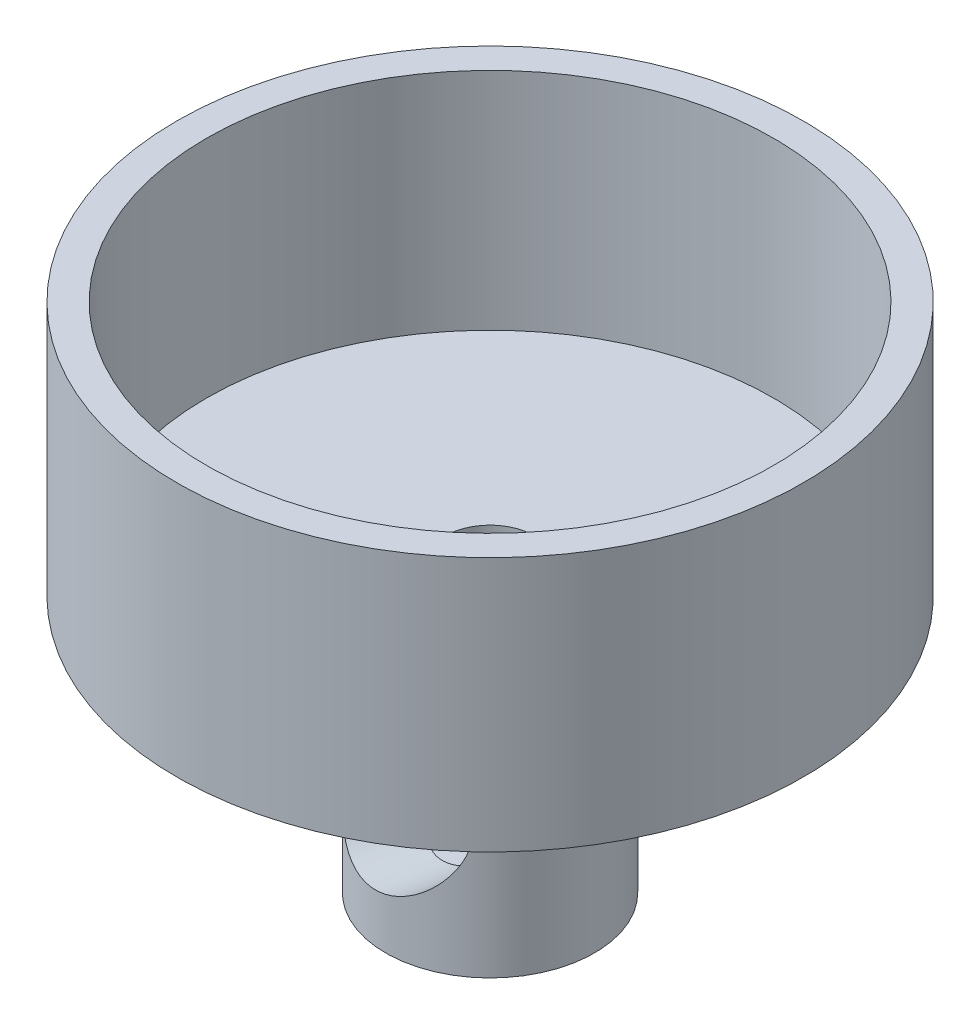
ISO-10303-21;
HEADER;
FILE_DESCRIPTION(('STEP AP214'),'2;1');
FILE_NAME('part.step','',(''),(''),'','','');
FILE_SCHEMA(('AUTOMOTIVE_DESIGN { 1 0 10303 214 1 1 1 1 }'));
ENDSEC;
DATA;
#1=APPLICATION_CONTEXT('core data for automotive mechanical design processes');
#2=APPLICATION_PROTOCOL_DEFINITION('international standard','automotive_design',2000,#1);
#3=PRODUCT_CONTEXT('',#1,'mechanical');
#4=PRODUCT('Part','Part','',(#3));
#5=PRODUCT_RELATED_PRODUCT_CATEGORY('part','',(#4));
#6=PRODUCT_DEFINITION_FORMATION('','',#4);
#7=PRODUCT_DEFINITION_CONTEXT('part definition',#1,'design');
#8=PRODUCT_DEFINITION('design','',#6,#7);
#9=PRODUCT_DEFINITION_SHAPE('','',#8);
#10=(LENGTH_UNIT() NAMED_UNIT(*) SI_UNIT(.MILLI.,.METRE.));
#11=(NAMED_UNIT(*) PLANE_ANGLE_UNIT() SI_UNIT($,.RADIAN.));
#12=(NAMED_UNIT(*) SI_UNIT($,.STERADIAN.) SOLID_ANGLE_UNIT());
#13=UNCERTAINTY_MEASURE_WITH_UNIT(LENGTH_MEASURE(1.E-05),#10,'distance_accuracy_value','');
#14=(GEOMETRIC_REPRESENTATION_CONTEXT(3) GLOBAL_UNCERTAINTY_ASSIGNED_CONTEXT((#13)) GLOBAL_UNIT_ASSIGNED_CONTEXT((#10,
#11,#12)) REPRESENTATION_CONTEXT('',''));
#15=CARTESIAN_POINT('',(0.,0.,0.));
#16=DIRECTION('',(0.,0.,1.));
#17=DIRECTION('',(1.,0.,0.));
#18=AXIS2_PLACEMENT_3D('',#15,#16,#17);
#19=CARTESIAN_POINT('',(-21.,19.835741860415,0.));
#20=DIRECTION('',(0.,1.,0.));
#21=DIRECTION('',(-1.,0.,0.));
#22=AXIS2_PLACEMENT_3D('',#19,#20,#21);
#23=PLANE('',#22);
#24=CARTESIAN_POINT('',(0.,19.835741860415,0.));
#25=DIRECTION('',(0.,1.,0.));
#26=DIRECTION('',(-1.,0.,0.));
#27=AXIS2_PLACEMENT_3D('',#24,#25,#26);
#28=CIRCLE('',#27,21.);
#29=CARTESIAN_POINT('',(-21.,19.835741860415,0.));
#30=VERTEX_POINT('',#29);
#31=EDGE_CURVE('E118',#30,#30,#28,.T.);
#32=ORIENTED_EDGE('',*,*,#31,.T.);
#33=EDGE_LOOP('',(#32));
#34=FACE_BOUND('',#33,.T.);
#35=CARTESIAN_POINT('',(0.,19.835741860415,0.));
#36=DIRECTION('',(0.,1.,0.));
#37=DIRECTION('',(-1.,0.,0.));
#38=AXIS2_PLACEMENT_3D('',#35,#36,#37);
#39=CIRCLE('',#38,19.);
#40=CARTESIAN_POINT('',(-19.,19.835741860415,0.));
#41=VERTEX_POINT('',#40);
#42=EDGE_CURVE('E46',#41,#41,#39,.T.);
#43=ORIENTED_EDGE('',*,*,#42,.F.);
#44=EDGE_LOOP('',(#43));
#45=FACE_BOUND('',#44,.T.);
#46=ADVANCED_FACE('F35',(#34,#45),#23,.T.);
#47=CARTESIAN_POINT('',(0.,8.52376627553102,0.));
#48=DIRECTION('',(0.,1.,0.));
#49=DIRECTION('',(-1.,0.,0.));
#50=AXIS2_PLACEMENT_3D('',#47,#48,#49);
#51=CYLINDRICAL_SURFACE('',#50,19.);
#52=ORIENTED_EDGE('',*,*,#42,.T.);
#53=EDGE_LOOP('',(#52));
#54=FACE_BOUND('',#53,.T.);
#55=CARTESIAN_POINT('',(0.,4.75482653047732,0.));
#56=DIRECTION('',(0.,1.,0.));
#57=DIRECTION('',(-1.,0.,0.));
#58=AXIS2_PLACEMENT_3D('',#55,#56,#57);
#59=CIRCLE('',#58,19.);
#60=CARTESIAN_POINT('',(-19.,4.75482653047732,0.));
#61=VERTEX_POINT('',#60);
#62=EDGE_CURVE('E50',#61,#61,#59,.T.);
#63=ORIENTED_EDGE('',*,*,#62,.F.);
#64=EDGE_LOOP('',(#63));
#65=FACE_BOUND('',#64,.T.);
#66=ADVANCED_FACE('F91',(#54,#65),#51,.F.);
#67=CARTESIAN_POINT('',(-19.,4.75482653047731,0.));
#68=DIRECTION('',(0.,1.,0.));
#69=DIRECTION('',(-1.,0.,0.));
#70=AXIS2_PLACEMENT_3D('',#67,#68,#69);
#71=PLANE('',#70);
#72=ORIENTED_EDGE('',*,*,#62,.T.);
#73=EDGE_LOOP('',(#72));
#74=FACE_BOUND('',#73,.T.);
#75=CARTESIAN_POINT('',(0.,4.75482653047732,0.));
#76=DIRECTION('',(0.,1.,0.));
#77=DIRECTION('',(-1.,0.,0.));
#78=AXIS2_PLACEMENT_3D('',#75,#76,#77);
#79=CIRCLE('',#78,2.99999999999999);
#80=CARTESIAN_POINT('',(-3.,4.75482653047732,0.));
#81=VERTEX_POINT('',#80);
#82=EDGE_CURVE('E103',#81,#81,#79,.T.);
#83=ORIENTED_EDGE('',*,*,#82,.F.);
#84=EDGE_LOOP('',(#83));
#85=FACE_BOUND('',#84,.T.);
#86=ADVANCED_FACE('F86',(#74,#85),#71,.T.);
#87=CARTESIAN_POINT('',(0.,8.52376627553102,0.));
#88=DIRECTION('',(0.,1.,0.));
#89=DIRECTION('',(-1.,0.,0.));
#90=AXIS2_PLACEMENT_3D('',#87,#88,#89);
#91=CYLINDRICAL_SURFACE('',#90,2.99999999999999);
#92=CARTESIAN_POINT('',(-3.,-1.61295364635005,0.));
#93=CARTESIAN_POINT('',(-2.99999813425858,-1.59300773536673,0.165449406648258));
#94=CARTESIAN_POINT('',(-2.98624962519628,-1.56436358998535,0.329844369903098));
#95=CARTESIAN_POINT('',(-2.93293143607571,-1.49444056953333,0.651631988695275));
#96=CARTESIAN_POINT('',(-2.89332336486097,-1.45314295755554,0.809013860893179));
#97=CARTESIAN_POINT('',(-2.79067278401693,-1.36369670251946,1.11249305460635));
#98=CARTESIAN_POINT('',(-2.72778837982358,-1.31559560412423,1.25865865597827));
#99=CARTESIAN_POINT('',(-2.58019495425639,-1.21730702470189,1.53871742267428));
#100=CARTESIAN_POINT('',(-2.49548460045791,-1.16711941645502,1.67260983807145));
#101=CARTESIAN_POINT('',(-2.29559308364867,-1.06401045934779,1.93929425909531));
#102=CARTESIAN_POINT('',(-2.17815018202013,-1.01135307788112,2.070503202599));
#103=CARTESIAN_POINT('',(-1.92004256627225,-0.914551055929027,2.31182679974649));
#104=CARTESIAN_POINT('',(-1.77938360900396,-0.870404310942537,2.42194666822969));
#105=CARTESIAN_POINT('',(-1.55692954750281,-0.81518104817027,2.56580524749679));
#106=CARTESIAN_POINT('',(-1.48266509020705,-0.798860849171129,2.60943957190819));
#107=CARTESIAN_POINT('',(-1.33012490240541,-0.769772138712408,2.69039179066334));
#108=CARTESIAN_POINT('',(-1.25185134828867,-0.757001723908216,2.72771306575693));
#109=CARTESIAN_POINT('',(-1.09194767520228,-0.735409473118811,2.79556550327131));
#110=CARTESIAN_POINT('',(-1.01031990120841,-0.726584928134775,2.82610131691766));
#111=CARTESIAN_POINT('',(-0.844432018577667,-0.713143470191582,2.88002655693443));
#112=CARTESIAN_POINT('',(-0.760172267472766,-0.708525988287028,2.90341694933688));
#113=CARTESIAN_POINT('',(-0.526228246838525,-0.70186380847923,2.95741558872313));
#114=CARTESIAN_POINT('',(-0.37456006920735,-0.704297251439661,2.98042298053267));
#115=CARTESIAN_POINT('',(-0.0703786990987542,-0.722308185936439,3.00305673338249));
#116=CARTESIAN_POINT('',(0.0821344347611251,-0.737884776754577,3.00268469651916));
#117=CARTESIAN_POINT('',(0.378956580699276,-0.779983920704835,2.9795738210914));
#118=CARTESIAN_POINT('',(0.523373008377095,-0.806148980666567,2.95753472227078));
#119=CARTESIAN_POINT('',(0.805708621486601,-0.867205829181671,2.89340896494964));
#120=CARTESIAN_POINT('',(0.943626510528086,-0.902099350285899,2.85131832482801));
#121=CARTESIAN_POINT('',(1.22285689700336,-0.981489992556648,2.7439049619019));
#122=CARTESIAN_POINT('',(1.36331452038127,-1.02657528314125,2.67680125468713));
#123=CARTESIAN_POINT('',(1.63144610229433,-1.12030972501868,2.52237261038033));
#124=CARTESIAN_POINT('',(1.75910671555882,-1.16896250697876,2.43502687193327));
#125=CARTESIAN_POINT('',(2.01418767971458,-1.27159326170345,2.23001295193606));
#126=CARTESIAN_POINT('',(2.13972814697185,-1.32550703314938,2.10996001589883));
#127=CARTESIAN_POINT('',(2.36937524712918,-1.42632952870933,1.84832075705914));
#128=CARTESIAN_POINT('',(2.47349997459438,-1.47324415724981,1.70675279006717));
#129=CARTESIAN_POINT('',(2.63938459828146,-1.54561380770526,1.43323580236985));
#130=CARTESIAN_POINT('',(2.70543189223863,-1.57344871417848,1.30452405891188));
#131=CARTESIAN_POINT('',(2.81874347492619,-1.6164857484919,1.0371605141926));
#132=CARTESIAN_POINT('',(2.86603112520227,-1.63170361435821,0.898521331392619));
#133=CARTESIAN_POINT('',(2.94006950262343,-1.64731326676457,0.614487487109448));
#134=CARTESIAN_POINT('',(2.96674691735029,-1.64765236459885,0.469070643313196));
#135=CARTESIAN_POINT('',(2.99841069269815,-1.63331232935741,0.176603191536284));
#136=CARTESIAN_POINT('',(3.00338754984854,-1.61862661984233,0.0295518960258319));
#137=CARTESIAN_POINT('',(2.99238928284299,-1.57747139681211,-0.254731929978259));
#138=CARTESIAN_POINT('',(2.97741099043544,-1.55160301964243,-0.392096406096173));
#139=CARTESIAN_POINT('',(2.9293376905859,-1.4912595774602,-0.661620839563119));
#140=CARTESIAN_POINT('',(2.89623610598238,-1.45678139031587,-0.79377888876065));
#141=CARTESIAN_POINT('',(2.80748615918167,-1.37740869153302,-1.06844781062637));
#142=CARTESIAN_POINT('',(2.74939394627122,-1.33173607346986,-1.20994155798187));
#143=CARTESIAN_POINT('',(2.61286710145269,-1.23788693650153,-1.48192702866313));
#144=CARTESIAN_POINT('',(2.53441569264924,-1.18970837889331,-1.61240956018069));
#145=CARTESIAN_POINT('',(2.34557424013859,-1.08802307301456,-1.87846237679876));
#146=CARTESIAN_POINT('',(2.2322014626982,-1.03475770195918,-2.01202316197116));
#147=CARTESIAN_POINT('',(1.98206600137973,-0.935861787547975,-2.25880225828007));
#148=CARTESIAN_POINT('',(1.8453069841772,-0.890230049547503,-2.37202375267036));
#149=CARTESIAN_POINT('',(1.62732413898457,-0.831951828574591,-2.52176641609383));
#150=CARTESIAN_POINT('',(1.5537557018548,-0.814418006590067,-2.56776651713635));
#151=CARTESIAN_POINT('',(1.40235278896611,-0.782829157603383,-2.65348070968102));
#152=CARTESIAN_POINT('',(1.32452060346878,-0.768772284918519,-2.69319813218819));
#153=CARTESIAN_POINT('',(1.16522795114331,-0.744574968963517,-2.76584502123201));
#154=CARTESIAN_POINT('',(1.0837701810884,-0.734431667266319,-2.79877943377275));
#155=CARTESIAN_POINT('',(0.917938494217453,-0.718363506061036,-2.85747041710355));
#156=CARTESIAN_POINT('',(0.833565004374997,-0.712438031622522,-2.88322803388806));
#157=CARTESIAN_POINT('',(0.599099927122686,-0.70226851030248,-2.94358126752397));
#158=CARTESIAN_POINT('',(0.44673821888692,-0.702541421883133,-2.97053386031378));
#159=CARTESIAN_POINT('',(0.140411595632272,-0.716587007761348,-3.00066828716248));
#160=CARTESIAN_POINT('',(-0.0135531295470067,-0.730358101110692,-3.00385290462285));
#161=CARTESIAN_POINT('',(-0.312157178842114,-0.769174057294741,-2.98730331490182));
#162=CARTESIAN_POINT('',(-0.456917048353101,-0.79372276601492,-2.96852309827844));
#163=CARTESIAN_POINT('',(-0.740417251713308,-0.851871719652209,-2.91079578933183));
#164=CARTESIAN_POINT('',(-0.879156515054024,-0.885473566690026,-2.87184512634803));
#165=CARTESIAN_POINT('',(-1.15954617838981,-0.962318212719698,-2.77118948511493));
#166=CARTESIAN_POINT('',(-1.30044277850865,-1.0061375015822,-2.70783270227802));
#167=CARTESIAN_POINT('',(-1.5699801783734,-1.09785491386373,-2.56100702856836));
#168=CARTESIAN_POINT('',(-1.6986090137445,-1.14575693456783,-2.47751877842476));
#169=CARTESIAN_POINT('',(-1.95669649456016,-1.24765773671014,-2.28053747799083));
#170=CARTESIAN_POINT('',(-2.08429980703213,-1.30167960747249,-2.164613453288));
#171=CARTESIAN_POINT('',(-2.3188412003042,-1.40381488170553,-1.91121153319989));
#172=CARTESIAN_POINT('',(-2.42579158961637,-1.45193179807711,-1.77374656460838));
#173=CARTESIAN_POINT('',(-2.59911074619047,-1.52827060559715,-1.50516844928089));
#174=CARTESIAN_POINT('',(-2.66930163937853,-1.55849646812629,-1.37709920534921));
#175=CARTESIAN_POINT('',(-2.79084706870754,-1.60658411971155,-1.11022390501737));
#176=CARTESIAN_POINT('',(-2.84222852634927,-1.62446361260189,-0.971433541040086));
#177=CARTESIAN_POINT('',(-2.92182312136273,-1.64468829092643,-0.694632768357372));
#178=CARTESIAN_POINT('',(-2.95116529890911,-1.64784169472833,-0.557007810226554));
#179=CARTESIAN_POINT('',(-2.99025895238495,-1.64037398673029,-0.279340133237803));
#180=CARTESIAN_POINT('',(-3.00000157081838,-1.62974665066022,-0.139296350078035));
#181=CARTESIAN_POINT('',(-3.,-1.61295364635005,0.));
#182=B_SPLINE_CURVE_WITH_KNOTS('',3,(#92,#93,#94,#95,#96,#97,#98,#99,#100,#101,#102,#103,#104,
#105,#106,#107,#108,#109,#110,#111,#112,#113,#114,#115,#116,#117,#118,#119,#120,#121,#122,#123,
#124,#125,#126,#127,#128,#129,#130,#131,#132,#133,#134,#135,#136,#137,#138,#139,#140,#141,#142,
#143,#144,#145,#146,#147,#148,#149,#150,#151,#152,#153,#154,#155,#156,#157,#158,#159,#160,#161,
#162,#163,#164,#165,#166,#167,#168,#169,#170,#171,#172,#173,#174,#175,#176,#177,#178,#179,#180,
#181),.UNSPECIFIED.,.T.,.F.,(4,2,2,2,2,2,2,2,2,2,2,2,2,2,2,2,2,2,2,2,2,2,2,2,2,2,2,2,2,2,2,2,2,
2,2,2,2,2,2,2,2,2,2,2,4),(0.,0.499313950381683,0.99937087401829,1.49609167481877,
1.9928428064832,2.54160563157351,3.09023258463032,3.35291166790224,3.61544963344403,
3.87780707829482,4.14012903776722,4.59784197252024,5.05552354211647,5.49889410255951,
5.94235273951772,6.42660636365606,6.91135984635255,7.45448339624027,7.99714614828607,
8.43726655192851,8.87683713630313,9.31796420323286,9.75928443650442,10.1793651823377,
10.5995984816951,11.0766656095663,11.5541271175152,12.1008763369299,12.6475399112389,
12.9127736230381,13.1778662361546,13.442764860491,13.7076248565013,14.1691875542896,
14.630696198906,15.0728822443912,15.5151465943554,15.9949789181406,16.4752745222218,
17.0148235047898,17.5540499334673,17.9996171096138,18.4445440392579,18.8647401647456,
19.285126144002),.UNSPECIFIED.);
#183=CARTESIAN_POINT('',(-3.,-1.61295364635005,0.));
#184=VERTEX_POINT('',#183);
#185=EDGE_CURVE('E71',#184,#184,#182,.T.);
#186=ORIENTED_EDGE('',*,*,#185,.F.);
#187=EDGE_LOOP('',(#186));
#188=FACE_BOUND('',#187,.T.);
#189=ORIENTED_EDGE('',*,*,#82,.T.);
#190=EDGE_LOOP('',(#189));
#191=FACE_BOUND('',#190,.T.);
#192=ADVANCED_FACE('F80',(#188,#191),#91,.F.);
#193=CARTESIAN_POINT('',(-7.,-14.4575063153785,0.));
#194=DIRECTION('',(0.,-1.,0.));
#195=DIRECTION('',(1.,0.,0.));
#196=AXIS2_PLACEMENT_3D('',#193,#194,#195);
#197=PLANE('',#196);
#198=CARTESIAN_POINT('',(0.,-14.4575063153785,0.));
#199=DIRECTION('',(0.,1.,0.));
#200=DIRECTION('',(-1.,0.,0.));
#201=AXIS2_PLACEMENT_3D('',#198,#199,#200);
#202=CIRCLE('',#201,6.99999999999999);
#203=CARTESIAN_POINT('',(-7.,-14.4575063153785,0.));
#204=VERTEX_POINT('',#203);
#205=EDGE_CURVE('E110',#204,#204,#202,.T.);
#206=ORIENTED_EDGE('',*,*,#205,.F.);
#207=EDGE_LOOP('',(#206));
#208=FACE_BOUND('',#207,.T.);
#209=ADVANCED_FACE('F85',(#208),#197,.T.);
#210=CARTESIAN_POINT('',(0.,8.52376627553102,0.));
#211=DIRECTION('',(0.,1.,0.));
#212=DIRECTION('',(-1.,0.,0.));
#213=AXIS2_PLACEMENT_3D('',#210,#211,#212);
#214=CYLINDRICAL_SURFACE('',#213,6.99999999999999);
#215=CARTESIAN_POINT('',(-5.98752808019803,-5.95406402326425,3.62622496390394));
#216=CARTESIAN_POINT('',(-5.9875317749274,-6.07663171470311,3.62621234928291));
#217=CARTESIAN_POINT('',(-5.984162460931,-6.19915783905972,3.63179793474228));
#218=CARTESIAN_POINT('',(-5.97076503539074,-6.44291320763332,3.65378430443133));
#219=CARTESIAN_POINT('',(-5.96073470220538,-6.56414200544241,3.67018869703177));
#220=CARTESIAN_POINT('',(-5.93417081971722,-6.8043496712029,3.71298288309737));
#221=CARTESIAN_POINT('',(-5.91762295902571,-6.92332297977446,3.73939464617525));
#222=CARTESIAN_POINT('',(-5.87827638475315,-7.15796144574633,3.80094743400571));
#223=CARTESIAN_POINT('',(-5.85547382838771,-7.27362452099094,3.83609382392091));
#224=CARTESIAN_POINT('',(-5.77883031732638,-7.61142240216264,3.95139484077724));
#225=CARTESIAN_POINT('',(-5.71633367353322,-7.8280374944796,4.04214413365777));
#226=CARTESIAN_POINT('',(-5.56961238028159,-8.24433535375521,4.24202279352672));
#227=CARTESIAN_POINT('',(-5.48539035682834,-8.44402016324963,4.35114993858159));
#228=CARTESIAN_POINT('',(-5.3332760096028,-8.75083122712244,4.53478583887399));
#229=CARTESIAN_POINT('',(-5.2720718588764,-8.86336532251168,4.60594469654965));
#230=CARTESIAN_POINT('',(-5.14192813927229,-9.08215438568896,4.75079640515602));
#231=CARTESIAN_POINT('',(-5.07298726827899,-9.18840829189242,4.82448968118586));
#232=CARTESIAN_POINT('',(-4.85426492349742,-9.49784290826654,5.04771468385444));
#233=CARTESIAN_POINT('',(-4.6926727590882,-9.6915161754988,5.19927992955958));
#234=CARTESIAN_POINT('',(-4.40853067076116,-9.97904303723317,5.43916350472412));
#235=CARTESIAN_POINT('',(-4.29597917382304,-10.0819823573985,5.52868373546757));
#236=CARTESIAN_POINT('',(-4.05931623907379,-10.2767528022554,5.70470571511916));
#237=CARTESIAN_POINT('',(-3.9352022126799,-10.3685814288909,5.7912067821191));
#238=CARTESIAN_POINT('',(-3.67591234671822,-10.5397880586011,5.95915215722928));
#239=CARTESIAN_POINT('',(-3.54075808635567,-10.6191895056484,6.04060580751323));
#240=CARTESIAN_POINT('',(-3.25972482195884,-10.7644422765773,6.19677268032399));
#241=CARTESIAN_POINT('',(-3.11385154706797,-10.8303007684735,6.27148945672241));
#242=CARTESIAN_POINT('',(-2.85787332333738,-10.9294960010079,6.39109342797385));
#243=CARTESIAN_POINT('',(-2.75025617578912,-10.966649744394,6.4381788916369));
#244=CARTESIAN_POINT('',(-2.53075240357307,-11.0332632154377,6.52758172584634));
#245=CARTESIAN_POINT('',(-2.41886673402082,-11.0627246528707,6.56990015477458));
#246=CARTESIAN_POINT('',(-2.19150530733888,-11.1135456604079,6.6491947330055));
#247=CARTESIAN_POINT('',(-2.07603203304544,-11.1349107042712,6.68617448114214));
#248=CARTESIAN_POINT('',(-1.84215709430454,-11.1692563009638,6.75435355767409));
#249=CARTESIAN_POINT('',(-1.72375532504349,-11.1822365532413,6.78555267883498));
#250=CARTESIAN_POINT('',(-1.48458388031029,-11.199629920179,6.84186672577902));
#251=CARTESIAN_POINT('',(-1.36380913796293,-11.204022082179,6.86696664092528));
#252=CARTESIAN_POINT('',(-1.1210538190345,-11.2041053808543,6.91074928323899));
#253=CARTESIAN_POINT('',(-0.999072821054507,-11.1997933616275,6.92942967998793));
#254=CARTESIAN_POINT('',(-0.754922820518411,-11.1825330610225,6.96026071591181));
#255=CARTESIAN_POINT('',(-0.63275385614656,-11.16958634887,6.97241254083227));
#256=CARTESIAN_POINT('',(-0.389089851488012,-11.1352548414533,6.99024606852856));
#257=CARTESIAN_POINT('',(-0.267595089278439,-11.1138667938734,6.99592527422187));
#258=CARTESIAN_POINT('',(-0.0303886565083987,-11.0638507517253,7.00090377618667));
#259=CARTESIAN_POINT('',(0.0853772577198919,-11.0355001932089,7.00041793036791));
#260=CARTESIAN_POINT('',(0.314754052812541,-10.9715869295172,6.99386286391375));
#261=CARTESIAN_POINT('',(0.428364178677939,-10.9360217468207,6.98779172273431));
#262=CARTESIAN_POINT('',(0.764956513369382,-10.8191079501105,6.96170717290481));
#263=CARTESIAN_POINT('',(0.983871831140064,-10.7275042994591,6.93382526860799));
#264=CARTESIAN_POINT('',(1.42963627546054,-10.5092047091869,6.85658960462227));
#265=CARTESIAN_POINT('',(1.65477790910579,-10.3797830351303,6.80523782225154));
#266=CARTESIAN_POINT('',(2.08387411534304,-10.0954846996213,6.6863329176136));
#267=CARTESIAN_POINT('',(2.28781038905508,-9.9405863461209,6.61876596628021));
#268=CARTESIAN_POINT('',(2.59495754087088,-9.67511540482472,6.50241230847631));
#269=CARTESIAN_POINT('',(2.70575596836529,-9.57168893509451,6.45696529140666));
#270=CARTESIAN_POINT('',(2.91855373002616,-9.35718673697565,6.36360959520005));
#271=CARTESIAN_POINT('',(3.02055459944206,-9.24611234932307,6.31570134790675));
#272=CARTESIAN_POINT('',(3.21538471455288,-9.0164897069045,6.21877354628235));
#273=CARTESIAN_POINT('',(3.30820737001721,-8.89793618051629,6.16975322405535));
#274=CARTESIAN_POINT('',(3.48400081302721,-8.65360453972622,6.07221998271665));
#275=CARTESIAN_POINT('',(3.56697380104518,-8.5278280483279,6.02370695248986));
#276=CARTESIAN_POINT('',(3.76942855669627,-8.19071292225844,5.90022530267062));
#277=CARTESIAN_POINT('',(3.88064185491746,-7.97363202999034,5.82700101478516));
#278=CARTESIAN_POINT('',(4.07114497658448,-7.52181292463424,5.69554583014847));
#279=CARTESIAN_POINT('',(4.15050692336689,-7.28711604882228,5.63728116833633));
#280=CARTESIAN_POINT('',(4.25937473915435,-6.85116396524696,5.55530950049276));
#281=CARTESIAN_POINT('',(4.29564440378424,-6.65249999858529,5.52704204447875));
#282=CARTESIAN_POINT('',(4.34088963696087,-6.25031912990332,5.49159124548811));
#283=CARTESIAN_POINT('',(4.34990012572912,-6.04680877364735,5.484380927788));
#284=CARTESIAN_POINT('',(4.3398065670434,-5.64088636171641,5.49236711414245));
#285=CARTESIAN_POINT('',(4.32069217130171,-5.438474737817,5.50757186561562));
#286=CARTESIAN_POINT('',(4.2561244792683,-5.04030302426983,5.55760847321045));
#287=CARTESIAN_POINT('',(4.21062622648892,-4.84455489303176,5.59247382700027));
#288=CARTESIAN_POINT('',(4.07505783544122,-4.39185205717135,5.69238617779256));
#289=CARTESIAN_POINT('',(3.97467880550498,-4.13941183633088,5.76384549611514));
#290=CARTESIAN_POINT('',(3.79721068643558,-3.7777128743197,5.88100943523809));
#291=CARTESIAN_POINT('',(3.73347244701609,-3.65983340619038,5.92178521351573));
#292=CARTESIAN_POINT('',(3.59764415556294,-3.42969026647785,6.00527349195004));
#293=CARTESIAN_POINT('',(3.52555485790549,-3.31742608895825,6.0479858169608));
#294=CARTESIAN_POINT('',(3.29225020411233,-2.98142034913437,6.18010382290179));
#295=CARTESIAN_POINT('',(3.11818854943963,-2.76689671873982,6.2705813462859));
#296=CARTESIAN_POINT('',(2.73990766913262,-2.36300890049934,6.44487022885091));
#297=CARTESIAN_POINT('',(2.53567379749319,-2.17365701664564,6.52867832002747));
#298=CARTESIAN_POINT('',(2.1848439674376,-1.89142255121039,6.65179154221364));
#299=CARTESIAN_POINT('',(2.0468667652472,-1.78973428768699,6.6956987218779));
#300=CARTESIAN_POINT('',(1.76122294882926,-1.59760951094562,6.77643743842098));
#301=CARTESIAN_POINT('',(1.61355414671577,-1.50717555183285,6.81326737018373));
#302=CARTESIAN_POINT('',(1.30969355315955,-1.33889285424018,6.87813953093327));
#303=CARTESIAN_POINT('',(1.15351675892512,-1.26102287157554,6.9061966706566));
#304=CARTESIAN_POINT('',(0.833621504827193,-1.119014165138,6.95206013033186));
#305=CARTESIAN_POINT('',(0.669907173470504,-1.05486803066782,6.96987199141819));
#306=CARTESIAN_POINT('',(0.387365760871211,-0.958901515880964,6.99024077003092));
#307=CARTESIAN_POINT('',(0.270059837679683,-0.923186782011059,6.99579207599902));
#308=CARTESIAN_POINT('',(0.0332512650042843,-0.859466122391049,7.00092190908424));
#309=CARTESIAN_POINT('',(-0.0862508903002979,-0.831458484566472,7.00050176380874));
#310=CARTESIAN_POINT('',(-0.326602338211857,-0.783544053534719,6.99340949152715));
#311=CARTESIAN_POINT('',(-0.447450616565295,-0.763631535895064,6.9867417935188));
#312=CARTESIAN_POINT('',(-0.689722115560586,-0.732169807753093,6.96699742495578));
#313=CARTESIAN_POINT('',(-0.811145357513928,-0.720620909736475,6.95392051496755));
#314=CARTESIAN_POINT('',(-1.05390675212675,-0.706052011608331,6.92129410308307));
#315=CARTESIAN_POINT('',(-1.17524414233109,-0.703050658104013,6.90173055403676));
#316=CARTESIAN_POINT('',(-1.41667239352185,-0.70567856076528,6.85624781028972));
#317=CARTESIAN_POINT('',(-1.53676278703121,-0.711310943758835,6.83032631582669));
#318=CARTESIAN_POINT('',(-1.77472701208312,-0.73112073070626,6.77239529846934));
#319=CARTESIAN_POINT('',(-1.89260117752278,-0.74529683665026,6.74038670086705));
#320=CARTESIAN_POINT('',(-2.12536580782462,-0.781980878104129,6.67065133908762));
#321=CARTESIAN_POINT('',(-2.24025510431287,-0.804492025159774,6.63292237412883));
#322=CARTESIAN_POINT('',(-2.46294513014971,-0.85673887061034,6.55343118808913));
#323=CARTESIAN_POINT('',(-2.57085499945575,-0.886241585462777,6.51182097854819));
#324=CARTESIAN_POINT('',(-2.78262179623965,-0.952421860095038,6.42418637352148));
#325=CARTESIAN_POINT('',(-2.88647729424728,-0.989101923508293,6.37816044058788));
#326=CARTESIAN_POINT('',(-3.1912197269927,-1.10929243918579,6.23429730497974));
#327=CARTESIAN_POINT('',(-3.38544352524168,-1.20299176535375,6.13061627439076));
#328=CARTESIAN_POINT('',(-3.77445556886688,-1.42604286923746,5.90003029405363));
#329=CARTESIAN_POINT('',(-3.96681543463871,-1.55823096362869,5.77182501070806));
#330=CARTESIAN_POINT('',(-4.32570664751649,-1.84810789505177,5.50798338780075));
#331=CARTESIAN_POINT('',(-4.4922139775223,-2.00582016967665,5.3723402948865));
#332=CARTESIAN_POINT('',(-4.73766446391233,-2.27595035108252,5.15457990286169));
#333=CARTESIAN_POINT('',(-4.82496461490918,-2.38120335807841,5.07278829180588));
#334=CARTESIAN_POINT('',(-4.99034339140351,-2.59941781285356,4.91018364787169));
#335=CARTESIAN_POINT('',(-5.06842371968437,-2.71237783114685,4.82937043677744));
#336=CARTESIAN_POINT('',(-5.21547624993135,-2.94584024173781,4.67017699534576));
#337=CARTESIAN_POINT('',(-5.28444258576121,-3.06634741886621,4.59179835658165));
#338=CARTESIAN_POINT('',(-5.41318775654693,-3.31467123162867,4.43929820231709));
#339=CARTESIAN_POINT('',(-5.47296896520146,-3.44248596702625,4.3651755900497));
#340=CARTESIAN_POINT('',(-5.61460356446464,-3.78007134334287,4.18282255127497));
#341=CARTESIAN_POINT('',(-5.68974649990417,-3.99521115904045,4.07908957016629));
#342=CARTESIAN_POINT('',(-5.81599994826014,-4.44237945486642,3.89698704112803));
#343=CARTESIAN_POINT('',(-5.86717430622688,-4.67436114505462,3.81855028748806));
#344=CARTESIAN_POINT('',(-5.93246135302357,-5.08181063102587,3.71597200025155));
#345=CARTESIAN_POINT('',(-5.95303999768303,-5.25391986954138,3.68265550240002));
#346=CARTESIAN_POINT('',(-5.98056623698189,-5.60207107246537,3.63779818316408));
#347=CARTESIAN_POINT('',(-5.98752277618121,-5.77811037944162,3.62624307298725));
#348=CARTESIAN_POINT('',(-5.98752808019803,-5.95406402326425,3.62622496390394));
#349=B_SPLINE_CURVE_WITH_KNOTS('',3,(#215,#216,#217,#218,#219,#220,#221,#222,#223,#224,#225,
#226,#227,#228,#229,#230,#231,#232,#233,#234,#235,#236,#237,#238,#239,#240,#241,#242,#243,#244,
#245,#246,#247,#248,#249,#250,#251,#252,#253,#254,#255,#256,#257,#258,#259,#260,#261,#262,#263,
#264,#265,#266,#267,#268,#269,#270,#271,#272,#273,#274,#275,#276,#277,#278,#279,#280,#281,#282,
#283,#284,#285,#286,#287,#288,#289,#290,#291,#292,#293,#294,#295,#296,#297,#298,#299,#300,#301,
#302,#303,#304,#305,#306,#307,#308,#309,#310,#311,#312,#313,#314,#315,#316,#317,#318,#319,#320,
#321,#322,#323,#324,#325,#326,#327,#328,#329,#330,#331,#332,#333,#334,#335,#336,#337,#338,#339,
#340,#341,#342,#343,#344,#345,#346,#347,#348),.UNSPECIFIED.,.T.,.F.,(4,2,2,2,2,2,2,2,2,2,2,2,2,
2,2,2,2,2,2,2,2,2,2,2,2,2,2,2,2,2,2,2,2,2,2,2,2,2,2,2,2,2,2,2,2,2,2,2,2,2,2,2,2,2,2,2,2,2,2,2,2,
2,2,2,2,2,4),(0.,0.367462658016023,0.735047936993043,1.10344491187858,1.47206873286566,
2.19816355349566,2.92417065017838,3.36343873780685,3.80278086689614,4.68214964881995,
5.21211545781673,5.74220020033229,6.27127255627198,6.80006415995792,7.16930619973803,
7.53846609777428,7.90737596933489,8.2762990636894,8.64612111490075,9.01607727772737,
9.3859662248901,9.75599782387141,10.113169955957,10.4704649501746,11.1845353076513,
11.9759230379392,12.7679881149161,13.2423068640336,13.7165426722723,14.1911165601907,
14.665584225247,15.4270015192712,16.1866848190246,16.7958023816759,17.4041393064061,
18.0127001189868,18.62230094193,19.4600731746533,19.8800363041628,20.2999615266786,
21.1691006524604,22.0386630649399,22.5688091896844,23.0990754097445,23.6284353974293,
24.157508812173,24.5253858742875,24.893181149137,25.2607158846923,25.628264351554,
25.9966140194416,26.3650971218157,26.7335242562961,27.1020934961338,27.4597783541649,
27.8175882045001,28.5326869485598,29.3287915974195,30.1256314613457,30.6032562836257,
31.0807927562794,31.5586351091777,32.0363537655327,32.7850055656634,33.5316516802786,
34.0595142009726,34.5870299996928),.UNSPECIFIED.);
#350=CARTESIAN_POINT('',(-5.98752808019803,-5.95406402326425,3.62622496390394));
#351=VERTEX_POINT('',#350);
#352=EDGE_CURVE('E38',#351,#351,#349,.T.);
#353=ORIENTED_EDGE('',*,*,#352,.F.);
#354=EDGE_LOOP('',(#353));
#355=FACE_BOUND('',#354,.T.);
#356=CARTESIAN_POINT('',(-4.34622455469875,-5.95406402326425,-5.4872882300945));
#357=CARTESIAN_POINT('',(-4.34623241821822,-5.83149633182539,-5.4872776970631));
#358=CARTESIAN_POINT('',(-4.34112612696665,-5.70897020746879,-5.49133686340417));
#359=CARTESIAN_POINT('',(-4.32089996657923,-5.46521483889519,-5.50726777358509));
#360=CARTESIAN_POINT('',(-4.30577675651722,-5.3439860410861,-5.51914212400181));
#361=CARTESIAN_POINT('',(-4.26595206085076,-5.10377837532561,-5.54998001998931));
#362=CARTESIAN_POINT('',(-4.24122949839403,-4.98480506675405,-5.56895916190671));
#363=CARTESIAN_POINT('',(-4.18288084125617,-4.75016660078218,-5.61291746950489));
#364=CARTESIAN_POINT('',(-4.14924927346215,-4.63450352553757,-5.63790032259629));
#365=CARTESIAN_POINT('',(-4.03719563611946,-4.29670564436586,-5.71921781538957));
#366=CARTESIAN_POINT('',(-3.94696550226655,-4.08009055204891,-5.78246168931117));
#367=CARTESIAN_POINT('',(-3.73973006089967,-3.66379269277329,-5.91859430261862));
#368=CARTESIAN_POINT('',(-3.62272798957491,-3.46410788327888,-5.99148187582625));
#369=CARTESIAN_POINT('',(-3.41610504746135,-3.15729681940607,-6.11051077273953));
#370=CARTESIAN_POINT('',(-3.33392082292896,-3.04476272401682,-6.15584601653347));
#371=CARTESIAN_POINT('',(-3.16141893101841,-2.82597366083954,-6.24619258551014));
#372=CARTESIAN_POINT('',(-3.07109989503112,-2.71971975463609,-6.29120385480628));
#373=CARTESIAN_POINT('',(-2.7882423277319,-2.41028513826197,-6.42409652783498));
#374=CARTESIAN_POINT('',(-2.58392573760479,-2.21661187102971,-6.50976322091312));
#375=CARTESIAN_POINT('',(-2.23394704235661,-1.92908500929534,-6.63544444013442));
#376=CARTESIAN_POINT('',(-2.09723583945275,-1.82614568913005,-6.68007355816236));
#377=CARTESIAN_POINT('',(-1.81403288957525,-1.63137524427314,-6.76246998518002));
#378=CARTESIAN_POINT('',(-1.66753895456311,-1.53954661763759,-6.80023575201313));
#379=CARTESIAN_POINT('',(-1.36594847545797,-1.36833998792739,-6.86716905108356));
#380=CARTESIAN_POINT('',(-1.21086889547163,-1.28893854088016,-6.89635286697505));
#381=CARTESIAN_POINT('',(-0.893010408506721,-1.14368576995118,-6.94466197714496));
#382=CARTESIAN_POINT('',(-0.730235630844917,-1.07782727805497,-6.96379260076019));
#383=CARTESIAN_POINT('',(-0.448613856580806,-0.978632045520562,-6.98657718378733));
#384=CARTESIAN_POINT('',(-0.33133142798579,-0.941478302134506,-6.9931592258445));
#385=CARTESIAN_POINT('',(-0.0944288203529388,-0.87486483109082,-7.00036528430343));
#386=CARTESIAN_POINT('',(0.0251908328237733,-0.845403393657812,-7.00099062580441));
#387=CARTESIAN_POINT('',(0.265930867110118,-0.794582386120617,-6.99598219576355));
#388=CARTESIAN_POINT('',(0.387050176927844,-0.773217342257311,-6.99035266313848));
#389=CARTESIAN_POINT('',(0.630016545759239,-0.738871745564709,-6.97265472357773));
#390=CARTESIAN_POINT('',(0.751863630701935,-0.725891493287205,-6.96058608586145));
#391=CARTESIAN_POINT('',(0.995654301675312,-0.70849812634947,-6.92992078616738));
#392=CARTESIAN_POINT('',(1.11759739937965,-0.704105964349492,-6.91130828897623));
#393=CARTESIAN_POINT('',(1.3603748649995,-0.704022665674222,-6.86764861853296));
#394=CARTESIAN_POINT('',(1.48120881481089,-0.708334684900978,-6.84259911426893));
#395=CARTESIAN_POINT('',(1.72077483341321,-0.725594985506004,-6.78631502887217));
#396=CARTESIAN_POINT('',(1.83950728009672,-0.738541697658482,-6.755081572305));
#397=CARTESIAN_POINT('',(2.07408332493052,-0.772873205075169,-6.6867861766588));
#398=CARTESIAN_POINT('',(2.18992579130435,-0.794261252655089,-6.64972199440566));
#399=CARTESIAN_POINT('',(2.4139651948579,-0.844277294803191,-6.57163215585624));
#400=CARTESIAN_POINT('',(2.522287926206,-0.872627853319654,-6.5307889334496));
#401=CARTESIAN_POINT('',(2.73496585510873,-0.936541117011328,-6.44462176115736));
#402=CARTESIAN_POINT('',(2.83931967507076,-0.972106299707773,-6.39929627479809));
#403=CARTESIAN_POINT('',(3.145663328437,-1.08902009641802,-6.25742178958293));
#404=CARTESIAN_POINT('',(3.34109667130401,-1.18062374706938,-6.15491751924417));
#405=CARTESIAN_POINT('',(3.73190767059683,-1.39892333734157,-5.92701830809282));
#406=CARTESIAN_POINT('',(3.92498805616937,-1.5283450113982,-5.8003465848857));
#407=CARTESIAN_POINT('',(4.28564071740252,-1.81264334690724,-5.53921139288812));
#408=CARTESIAN_POINT('',(4.45319101929552,-1.96754170040761,-5.40474134795767));
#409=CARTESIAN_POINT('',(4.70044686961806,-2.23301264170378,-5.18854215500314));
#410=CARTESIAN_POINT('',(4.78842837059438,-2.33643911143399,-5.10729574965671));
#411=CARTESIAN_POINT('',(4.95528632083993,-2.55094130955286,-4.94556573444014));
#412=CARTESIAN_POINT('',(5.03416435955712,-2.66201569720544,-4.86508199366944));
#413=CARTESIAN_POINT('',(5.18293736725297,-2.89163833962401,-4.70627278529988));
#414=CARTESIAN_POINT('',(5.25282589217138,-3.01019186601222,-4.62794889722341));
#415=CARTESIAN_POINT('',(5.38354709694099,-3.25452350680229,-4.47521371989046));
#416=CARTESIAN_POINT('',(5.44438180024134,-3.38029999820061,-4.40080155880927));
#417=CARTESIAN_POINT('',(5.59103639530686,-3.71741512427007,-4.2144468548869));
#418=CARTESIAN_POINT('',(5.66971588827283,-3.93449601653817,-4.10702371294726));
#419=CARTESIAN_POINT('',(5.80238801020926,-4.38631512189426,-3.91736609250022));
#420=CARTESIAN_POINT('',(5.85643645113219,-4.62101199770622,-3.83507480835069));
#421=CARTESIAN_POINT('',(5.92986608314111,-5.05696408128154,-3.7202721742937));
#422=CARTESIAN_POINT('',(5.95399506438046,-5.25562804794322,-3.68112718858392));
#423=CARTESIAN_POINT('',(5.98402957752057,-5.65780891662519,-3.63211883934913));
#424=CARTESIAN_POINT('',(5.98995842474908,-5.86131927288116,-3.62221801313511));
#425=CARTESIAN_POINT('',(5.98328523956408,-6.26724168481209,-3.63322381610066));
#426=CARTESIAN_POINT('',(5.97067638637877,-6.4696533087115,-3.65414178477074));
#427=CARTESIAN_POINT('',(5.92762209567826,-6.86782502225867,-3.72356063672318));
#428=CARTESIAN_POINT('',(5.89714621285357,-7.06357315349674,-3.77210859720478));
#429=CARTESIAN_POINT('',(5.80495269479076,-7.51627598935715,-3.91303986314426));
#430=CARTESIAN_POINT('',(5.73581098785507,-7.76871621019763,-4.01502911840229));
#431=CARTESIAN_POINT('',(5.61036899998586,-8.1304151722088,-4.18674583161406));
#432=CARTESIAN_POINT('',(5.56486116921681,-8.24829464033812,-4.24719634523586));
#433=CARTESIAN_POINT('',(5.46669412244705,-8.47843778005065,-4.37282615190415));
#434=CARTESIAN_POINT('',(5.41403555232025,-8.59070195757026,-4.43800501762587));
#435=CARTESIAN_POINT('',(5.2414824016437,-8.92670769739413,-4.64321622386707));
#436=CARTESIAN_POINT('',(5.10992260746123,-9.14123132778868,-4.78873482205914));
#437=CARTESIAN_POINT('',(4.81621461513217,-9.54511914602917,-5.0840459363668));
#438=CARTESIAN_POINT('',(4.654051551076,-9.73447102988286,-5.23384049944372));
#439=CARTESIAN_POINT('',(4.36821589405014,-10.0167054953181,-5.47161436744962));
#440=CARTESIAN_POINT('',(4.25422607509212,-10.1183937588415,-5.56089969616762));
#441=CARTESIAN_POINT('',(4.01469730104615,-10.3105185355829,-5.73621967965742));
#442=CARTESIAN_POINT('',(3.88915573555337,-10.4009524946957,-5.82225359346415));
#443=CARTESIAN_POINT('',(3.62701930773544,-10.5692351922883,-5.98905932108616));
#444=CARTESIAN_POINT('',(3.49044370232179,-10.647105174953,-6.06983987662207));
#445=CARTESIAN_POINT('',(3.20664841503636,-10.7891138813905,-6.22442533985307));
#446=CARTESIAN_POINT('',(3.05943453543994,-10.8532600158607,-6.29823400019246));
#447=CARTESIAN_POINT('',(2.80175163991675,-10.9492265306475,-6.41589479370739));
#448=CARTESIAN_POINT('',(2.69375287528879,-10.9849412645174,-6.46202248010726));
#449=CARTESIAN_POINT('',(2.4736128853516,-11.0486619241375,-6.54944673366709));
#450=CARTESIAN_POINT('',(2.36147258634171,-11.076669561962,-6.59074437261251));
#451=CARTESIAN_POINT('',(2.13374832906961,-11.1245839929938,-6.66795047009949));
#452=CARTESIAN_POINT('',(2.01816686650367,-11.1444965106334,-6.70386272551234));
#453=CARTESIAN_POINT('',(1.78422918911707,-11.1759582387754,-6.76988152900304));
#454=CARTESIAN_POINT('',(1.66587287079143,-11.187507136792,-6.79998786012623));
#455=CARTESIAN_POINT('',(1.42698184780908,-11.2020760349202,-6.85410492402722));
#456=CARTESIAN_POINT('',(1.30644295699383,-11.2050773884245,-6.87810222624884));
#457=CARTESIAN_POINT('',(1.06431605426924,-11.2024494857632,-6.91970563270536));
#458=CARTESIAN_POINT('',(0.942727678133986,-11.1968171027697,-6.93730941858288));
#459=CARTESIAN_POINT('',(0.699504254551957,-11.1770073158222,-6.96603817417123));
#460=CARTESIAN_POINT('',(0.577869216998974,-11.1628312098782,-6.97716412752567));
#461=CARTESIAN_POINT('',(0.335400444916388,-11.1261471684244,-6.99301620520725));
#462=CARTESIAN_POINT('',(0.214567037551653,-11.1036360213687,-6.99773985941282));
#463=CARTESIAN_POINT('',(-0.0218636961403855,-11.0513891759182,-7.00093429693055));
#464=CARTESIAN_POINT('',(-0.13751027194005,-11.0218864610657,-6.99958561702033));
#465=CARTESIAN_POINT('',(-0.366545133691644,-10.9557061864335,-6.99133744626978));
#466=CARTESIAN_POINT('',(-0.479932616366349,-10.9190261230202,-6.98443601587365));
#467=CARTESIAN_POINT('',(-0.815718128258601,-10.7988356073427,-6.95592913765338));
#468=CARTESIAN_POINT('',(-1.03391044119456,-10.7051362811748,-6.92652242947458));
#469=CARTESIAN_POINT('',(-1.47892630816364,-10.4820851772911,-6.84614119684383));
#470=CARTESIAN_POINT('',(-1.70392771466939,-10.3498970828998,-6.79310083760756));
#471=CARTESIAN_POINT('',(-2.13231735374293,-10.0600201514767,-6.6710450233516));
#472=CARTESIAN_POINT('',(-2.33568543430787,-9.90230787685186,-6.60201486031877));
#473=CARTESIAN_POINT('',(-2.64168531919582,-9.63217769544599,-6.48356824765102));
#474=CARTESIAN_POINT('',(-2.75203541555053,-9.5269246884501,-6.43737257428558));
#475=CARTESIAN_POINT('',(-2.96375207798022,-9.30871023367496,-6.34268115549088));
#476=CARTESIAN_POINT('',(-3.06512030202627,-9.19575021538166,-6.2941858371028));
#477=CARTESIAN_POINT('',(-3.25847208847204,-8.9622878047907,-6.19629771154545));
#478=CARTESIAN_POINT('',(-3.35044959804935,-8.8417806276623,-6.14690434939763));
#479=CARTESIAN_POINT('',(-3.52430916936698,-8.59345681489984,-6.04890197436206));
#480=CARTESIAN_POINT('',(-3.60619383829941,-8.46564207950226,-6.00029276174383));
#481=CARTESIAN_POINT('',(-3.80254792595842,-8.12805670318565,-5.87880999457738));
#482=CARTESIAN_POINT('',(-3.90915946487279,-7.91291688748806,-5.80781019256024));
#483=CARTESIAN_POINT('',(-4.09101141731466,-7.4657485916621,-5.68119608711782));
#484=CARTESIAN_POINT('',(-4.16633511087938,-7.23376690147389,-5.62554107456142));
#485=CARTESIAN_POINT('',(-4.2633071715451,-6.82631741550264,-5.55218493683557));
#486=CARTESIAN_POINT('',(-4.29421615344195,-6.65420817698713,-5.52814113340908));
#487=CARTESIAN_POINT('',(-4.33566251694209,-6.30605697406314,-5.49570547569126));
#488=CARTESIAN_POINT('',(-4.34621326612109,-6.13001766708689,-5.48730335092474));
#489=CARTESIAN_POINT('',(-4.34622455469875,-5.95406402326425,-5.4872882300945));
#490=B_SPLINE_CURVE_WITH_KNOTS('',3,(#356,#357,#358,#359,#360,#361,#362,#363,#364,#365,#366,
#367,#368,#369,#370,#371,#372,#373,#374,#375,#376,#377,#378,#379,#380,#381,#382,#383,#384,#385,
#386,#387,#388,#389,#390,#391,#392,#393,#394,#395,#396,#397,#398,#399,#400,#401,#402,#403,#404,
#405,#406,#407,#408,#409,#410,#411,#412,#413,#414,#415,#416,#417,#418,#419,#420,#421,#422,#423,
#424,#425,#426,#427,#428,#429,#430,#431,#432,#433,#434,#435,#436,#437,#438,#439,#440,#441,#442,
#443,#444,#445,#446,#447,#448,#449,#450,#451,#452,#453,#454,#455,#456,#457,#458,#459,#460,#461,
#462,#463,#464,#465,#466,#467,#468,#469,#470,#471,#472,#473,#474,#475,#476,#477,#478,#479,#480,
#481,#482,#483,#484,#485,#486,#487,#488,#489),.UNSPECIFIED.,.T.,.F.,(4,2,2,2,2,2,2,2,2,2,2,2,2,
2,2,2,2,2,2,2,2,2,2,2,2,2,2,2,2,2,2,2,2,2,2,2,2,2,2,2,2,2,2,2,2,2,2,2,2,2,2,2,2,2,2,2,2,2,2,2,2,
2,2,2,2,2,4),(0.,0.367462658016022,0.735047936993043,1.10344491187858,1.47206873286566,
2.19816355349566,2.92417065017838,3.36343873780685,3.80278086689614,4.68214964881995,
5.21211545781672,5.74220020033229,6.27127255627197,6.80006415995791,7.16930619973803,
7.53846609777428,7.90737596933489,8.2762990636894,8.64612111490075,9.01607727772737,
9.3859662248901,9.75599782387141,10.113169955957,10.4704649501746,11.1845353076513,
11.9759230379392,12.7679881149161,13.2423068640336,13.7165426722723,14.1911165601907,
14.665584225247,15.4270015192712,16.1866848190246,16.7958023816759,17.4041393064061,
18.0127001189868,18.62230094193,19.4600731746533,19.8800363041628,20.2999615266786,
21.1691006524604,22.0386630649399,22.5688091896844,23.0990754097445,23.6284353974293,
24.157508812173,24.5253858742875,24.893181149137,25.2607158846923,25.628264351554,
25.9966140194416,26.3650971218157,26.7335242562961,27.1020934961338,27.4597783541649,
27.8175882045001,28.5326869485598,29.3287915974195,30.1256314613457,30.6032562836257,
31.0807927562794,31.5586351091777,32.0363537655327,32.7850055656634,33.5316516802786,
34.0595142009726,34.5870299996928),.UNSPECIFIED.);
#491=CARTESIAN_POINT('',(-4.34622455469875,-5.95406402326425,-5.4872882300945));
#492=VERTEX_POINT('',#491);
#493=EDGE_CURVE('E10',#492,#492,#490,.T.);
#494=ORIENTED_EDGE('',*,*,#493,.F.);
#495=EDGE_LOOP('',(#494));
#496=FACE_BOUND('',#495,.T.);
#497=ORIENTED_EDGE('',*,*,#205,.T.);
#498=EDGE_LOOP('',(#497));
#499=FACE_BOUND('',#498,.T.);
#500=CARTESIAN_POINT('',(0.,2.75482653047732,0.));
#501=DIRECTION('',(0.,1.,0.));
#502=DIRECTION('',(-1.,0.,0.));
#503=AXIS2_PLACEMENT_3D('',#500,#501,#502);
#504=CIRCLE('',#503,6.99999999999999);
#505=CARTESIAN_POINT('',(-7.,2.75482653047732,0.));
#506=VERTEX_POINT('',#505);
#507=EDGE_CURVE('E113',#506,#506,#504,.T.);
#508=ORIENTED_EDGE('',*,*,#507,.F.);
#509=EDGE_LOOP('',(#508));
#510=FACE_BOUND('',#509,.T.);
#511=ADVANCED_FACE('F55',(#355,#496,#499,#510),#214,.T.);
#512=CARTESIAN_POINT('',(-9.30023295090511,2.75482653047732,0.));
#513=DIRECTION('',(0.,-1.,0.));
#514=DIRECTION('',(1.,0.,0.));
#515=AXIS2_PLACEMENT_3D('',#512,#513,#514);
#516=PLANE('',#515);
#517=ORIENTED_EDGE('',*,*,#507,.T.);
#518=EDGE_LOOP('',(#517));
#519=FACE_BOUND('',#518,.T.);
#520=CARTESIAN_POINT('',(0.,2.75482653047732,0.));
#521=DIRECTION('',(0.,1.,0.));
#522=DIRECTION('',(-1.,0.,0.));
#523=AXIS2_PLACEMENT_3D('',#520,#521,#522);
#524=CIRCLE('',#523,21.);
#525=CARTESIAN_POINT('',(-21.,2.75482653047731,0.));
#526=VERTEX_POINT('',#525);
#527=EDGE_CURVE('E116',#526,#526,#524,.T.);
#528=ORIENTED_EDGE('',*,*,#527,.F.);
#529=EDGE_LOOP('',(#528));
#530=FACE_BOUND('',#529,.T.);
#531=ADVANCED_FACE('F157',(#519,#530),#516,.T.);
#532=CARTESIAN_POINT('',(0.,8.52376627553102,0.));
#533=DIRECTION('',(0.,1.,0.));
#534=DIRECTION('',(-1.,0.,0.));
#535=AXIS2_PLACEMENT_3D('',#532,#533,#534);
#536=CYLINDRICAL_SURFACE('',#535,21.);
#537=ORIENTED_EDGE('',*,*,#527,.T.);
#538=EDGE_LOOP('',(#537));
#539=FACE_BOUND('',#538,.T.);
#540=ORIENTED_EDGE('',*,*,#31,.F.);
#541=EDGE_LOOP('',(#540));
#542=FACE_BOUND('',#541,.T.);
#543=ADVANCED_FACE('F64',(#539,#542),#536,.T.);
#544=CARTESIAN_POINT('',(1.24070884412704,-5.95406402326425,-6.88916842326451));
#545=DIRECTION('',(0.177244120589577,0.,-0.984166917609217));
#546=DIRECTION('',(-0.984166917609217,0.,-0.177244120589577));
#547=AXIS2_PLACEMENT_3D('',#544,#545,#546);
#548=CYLINDRICAL_SURFACE('',#547,5.24999999999999);
#549=CARTESIAN_POINT('',(-3.,-10.2951744001784,0.));
#550=CARTESIAN_POINT('',(-2.99999733683024,-10.2779552768618,-0.142878948768256));
#551=CARTESIAN_POINT('',(-2.98974662064848,-10.2672137791003,-0.286574788469708));
#552=CARTESIAN_POINT('',(-2.94860122493107,-10.2602731759307,-0.571344128735413));
#553=CARTESIAN_POINT('',(-2.91770970599044,-10.2640718445004,-0.712418027382137));
#554=CARTESIAN_POINT('',(-2.83649060315081,-10.2856035756814,-0.987340430051403));
#555=CARTESIAN_POINT('',(-2.7862047563443,-10.3033067995516,-1.12120375118297));
#556=CARTESIAN_POINT('',(-2.66814085455712,-10.3501689741848,-1.37881904976933));
#557=CARTESIAN_POINT('',(-2.60035047275717,-10.3793360054316,-1.50256382048329));
#558=CARTESIAN_POINT('',(-2.44611533032077,-10.4472199929442,-1.7429285692232));
#559=CARTESIAN_POINT('',(-2.35898741945247,-10.4862971582512,-1.85900451727496));
#560=CARTESIAN_POINT('',(-2.17002991428211,-10.5693728843625,-2.07647537933111));
#561=CARTESIAN_POINT('',(-2.06819328774872,-10.613373796929,-2.17786322425141));
#562=CARTESIAN_POINT('',(-1.83257721945965,-10.7104357533994,-2.3811500674027));
#563=CARTESIAN_POINT('',(-1.69632169218196,-10.7637433261559,-2.48008085104255));
#564=CARTESIAN_POINT('',(-1.40816262085658,-10.8668227739884,-2.65433023368434));
#565=CARTESIAN_POINT('',(-1.25625056573098,-10.9165927008541,-2.72963589887983));
#566=CARTESIAN_POINT('',(-0.933417625643328,-11.0094327205938,-2.85654230223503));
#567=CARTESIAN_POINT('',(-0.76199410749186,-11.0521768308526,-2.90713485624825));
#568=CARTESIAN_POINT('',(-0.498322081072391,-11.1057201708635,-2.95968509898528));
#569=CARTESIAN_POINT('',(-0.409337197415749,-11.1218063693091,-2.97331218252968));
#570=CARTESIAN_POINT('',(-0.229889301908227,-11.1499917732279,-2.9925397668731));
#571=CARTESIAN_POINT('',(-0.139426539912251,-11.1620916454686,-2.99814161052868));
#572=CARTESIAN_POINT('',(0.111783980289502,-11.1894518898866,-3.00219272823876));
#573=CARTESIAN_POINT('',(0.273306781211108,-11.2000372031863,-2.99187997528298));
#574=CARTESIAN_POINT('',(0.592732491212945,-11.2061858868906,-2.94528904412876));
#575=CARTESIAN_POINT('',(0.750637060902145,-11.2017562933695,-2.90902303406386));
#576=CARTESIAN_POINT('',(1.04418641083123,-11.1794435137732,-2.81625424807458));
#577=CARTESIAN_POINT('',(1.18057321294444,-11.1627626761358,-2.761783504645));
#578=CARTESIAN_POINT('',(1.44257718152451,-11.1188323942686,-2.63442646278476));
#579=CARTESIAN_POINT('',(1.56819279061011,-11.0915814248644,-2.56153750730165));
#580=CARTESIAN_POINT('',(1.81161522325061,-11.0272894053182,-2.39597614237558));
#581=CARTESIAN_POINT('',(1.92880665230142,-10.989859307986,-2.30255445744875));
#582=CARTESIAN_POINT('',(2.14694611270132,-10.9088678898236,-2.10065339890795));
#583=CARTESIAN_POINT('',(2.24788666081611,-10.8653037615944,-1.99216713091055));
#584=CARTESIAN_POINT('',(2.44376636272133,-10.7697222561594,-1.74798329900901));
#585=CARTESIAN_POINT('',(2.53640069426118,-10.7173271713027,-1.61057954277064));
#586=CARTESIAN_POINT('',(2.69814524815007,-10.6139377259348,-1.3219157963255));
#587=CARTESIAN_POINT('',(2.76722933411013,-10.5629449790622,-1.17064064611107));
#588=CARTESIAN_POINT('',(2.88357567590902,-10.4649556164393,-0.846412533682459));
#589=CARTESIAN_POINT('',(2.92915658420327,-10.4184242309953,-0.67269168053679));
#590=CARTESIAN_POINT('',(2.9737795086692,-10.3602212440507,-0.405934435785934));
#591=CARTESIAN_POINT('',(2.98469606963847,-10.3427566384108,-0.316018218399345));
#592=CARTESIAN_POINT('',(2.99834635611724,-10.3125037834358,-0.134762593488529));
#593=CARTESIAN_POINT('',(3.00108214896583,-10.2997143533673,-0.0434235513882201));
#594=CARTESIAN_POINT('',(2.99833703523603,-10.2808408760125,0.127748771545017));
#595=CARTESIAN_POINT('',(2.99388197495056,-10.2740995124421,0.207527767303131));
#596=CARTESIAN_POINT('',(2.97857497863549,-10.2649886546803,0.366717771094049));
#597=CARTESIAN_POINT('',(2.96772398180399,-10.2626185188158,0.446128831430389));
#598=CARTESIAN_POINT('',(2.93969731223624,-10.262364451338,0.603811003421143));
#599=CARTESIAN_POINT('',(2.92252367631169,-10.264479076021,0.682082473757658));
#600=CARTESIAN_POINT('',(2.88205491441853,-10.2730823691675,0.836755036711164));
#601=CARTESIAN_POINT('',(2.85876006469185,-10.2795708402661,0.913156213561877));
#602=CARTESIAN_POINT('',(2.78678281936581,-10.3030123723021,1.11940758788268));
#603=CARTESIAN_POINT('',(2.73210398485255,-10.3241592543333,1.2467502236048));
#604=CARTESIAN_POINT('',(2.60685675802554,-10.3763522175016,1.49104053360452));
#605=CARTESIAN_POINT('',(2.53628249257557,-10.4074019593737,1.60798434333014));
#606=CARTESIAN_POINT('',(2.37337684853299,-10.4796590277686,1.84099024408096));
#607=CARTESIAN_POINT('',(2.2795790023028,-10.5215698079976,1.95580577279125));
#608=CARTESIAN_POINT('',(2.07705989948441,-10.6094021553374,2.16968783595654));
#609=CARTESIAN_POINT('',(1.96832821811025,-10.6553265159712,2.26874326365517));
#610=CARTESIAN_POINT('',(1.7186192416064,-10.754963728863,2.4648603267043));
#611=CARTESIAN_POINT('',(1.57528005782615,-10.8087146315403,2.55891147926567));
#612=CARTESIAN_POINT('',(1.27304553053038,-10.9110504003729,2.72190676313284));
#613=CARTESIAN_POINT('',(1.11414589028492,-10.9596338318577,2.79084393473615));
#614=CARTESIAN_POINT('',(0.866138464959997,-11.0250187474283,2.87359084715189));
#615=CARTESIAN_POINT('',(0.781392506629251,-11.045652909027,2.89780116808891));
#616=CARTESIAN_POINT('',(0.609434031159479,-11.0837338670478,2.93877330276397));
#617=CARTESIAN_POINT('',(0.52222278995058,-11.1011822786269,2.95553889714479));
#618=CARTESIAN_POINT('',(0.346073581658148,-11.1323534352809,2.98130044894931));
#619=CARTESIAN_POINT('',(0.257137004889593,-11.1460790567134,2.99030241661218));
#620=CARTESIAN_POINT('',(0.0782764544210946,-11.1693830242442,3.00031506515234));
#621=CARTESIAN_POINT('',(-0.0116473542269987,-11.178962053088,3.00132706206881));
#622=CARTESIAN_POINT('',(-0.180380890176322,-11.1927390937097,2.99560964444807));
#623=CARTESIAN_POINT('',(-0.259181535299658,-11.1974582838834,2.98982764743157));
#624=CARTESIAN_POINT('',(-0.416240883326441,-11.2033507491527,2.97203485994029));
#625=CARTESIAN_POINT('',(-0.494499394966184,-11.2045228306484,2.96002197436797));
#626=CARTESIAN_POINT('',(-0.649745585585586,-11.2032836042122,2.92985947019167));
#627=CARTESIAN_POINT('',(-0.726734073290424,-11.2008746732807,2.91171392849113));
#628=CARTESIAN_POINT('',(-0.878873674548202,-11.1925484541687,2.86946447807146));
#629=CARTESIAN_POINT('',(-0.954024092398924,-11.1866298583533,2.84535835050309));
#630=CARTESIAN_POINT('',(-1.16545000006748,-11.1648813410276,2.76822795175073));
#631=CARTESIAN_POINT('',(-1.2988116234991,-11.1449046913865,2.70814461266672));
#632=CARTESIAN_POINT('',(-1.55389173450641,-11.0950073841693,2.57031004438921));
#633=CARTESIAN_POINT('',(-1.67560868068288,-11.0650854124755,2.49255648078359));
#634=CARTESIAN_POINT('',(-1.91255827144014,-10.9955279037817,2.31630386950014));
#635=CARTESIAN_POINT('',(-2.02690338853506,-10.9554002854464,2.21680851125812));
#636=CARTESIAN_POINT('',(-2.2384723144152,-10.8697899147446,2.00297467855456));
#637=CARTESIAN_POINT('',(-2.33568243071927,-10.8243029277257,1.88862445925452));
#638=CARTESIAN_POINT('',(-2.52291036903103,-10.7256110546378,1.63194862479703));
#639=CARTESIAN_POINT('',(-2.61046128764319,-10.6721579271286,1.48791402811132));
#640=CARTESIAN_POINT('',(-2.76062383696289,-10.5683936386443,1.18630447263948));
#641=CARTESIAN_POINT('',(-2.8232402925587,-10.5180818713976,1.0287321406243));
#642=CARTESIAN_POINT('',(-2.91403505396701,-10.4336237087256,0.727496320171743));
#643=CARTESIAN_POINT('',(-2.94599197788727,-10.3981831218795,0.585338842988918));
#644=CARTESIAN_POINT('',(-2.98896332021339,-10.3379017165744,0.295743291724242));
#645=CARTESIAN_POINT('',(-3.00000276443347,-10.313048259247,0.14831174312357));
#646=CARTESIAN_POINT('',(-3.,-10.2951744001784,0.));
#647=B_SPLINE_CURVE_WITH_KNOTS('',3,(#549,#550,#551,#552,#553,#554,#555,#556,#557,#558,#559,
#560,#561,#562,#563,#564,#565,#566,#567,#568,#569,#570,#571,#572,#573,#574,#575,#576,#577,#578,
#579,#580,#581,#582,#583,#584,#585,#586,#587,#588,#589,#590,#591,#592,#593,#594,#595,#596,#597,
#598,#599,#600,#601,#602,#603,#604,#605,#606,#607,#608,#609,#610,#611,#612,#613,#614,#615,#616,
#617,#618,#619,#620,#621,#622,#623,#624,#625,#626,#627,#628,#629,#630,#631,#632,#633,#634,#635,
#636,#637,#638,#639,#640,#641,#642,#643,#644,#645,#646),.UNSPECIFIED.,.T.,.F.,(4,2,2,2,2,2,2,2,
2,2,2,2,2,2,2,2,2,2,2,2,2,2,2,2,2,2,2,2,2,2,2,2,2,2,2,2,2,2,2,2,2,2,2,2,2,2,2,2,4),(0.,
0.431223644896788,0.862381274383269,1.29261617272213,1.72315487578887,2.17242069965764,
2.62190203274545,3.14943184323828,3.67724995323513,4.22510103457553,4.49905478744548,
4.77296269451119,5.25661865652014,5.74004800582029,6.18147479892085,6.62296530962985,
7.08454453458191,7.54633570413954,8.06551664450246,8.58527191736599,9.13832172809484,
9.41465539509756,9.69091922468681,9.93112479722569,10.1712951060573,10.4113881126328,
10.6514702860022,11.0701051422032,11.4888949325351,11.9493726535112,12.4101734672156,
12.9468031829351,13.4835814990386,13.7548115787045,14.0259037620981,14.2967858896467,
14.5676233988928,14.8047670241066,15.0419904391315,15.2790564605613,15.5162108638682,
15.9569700422291,16.3977874831385,16.8662939520816,17.3351731211825,17.8633875927128,
18.3914998035415,18.8396567086446,19.2872770964071),.UNSPECIFIED.);
#648=CARTESIAN_POINT('',(-3.,-10.2951744001784,0.));
#649=VERTEX_POINT('',#648);
#650=EDGE_CURVE('E76',#649,#649,#647,.T.);
#651=ORIENTED_EDGE('',*,*,#650,.T.);
#652=EDGE_LOOP('',(#651));
#653=FACE_BOUND('',#652,.T.);
#654=ORIENTED_EDGE('',*,*,#185,.T.);
#655=EDGE_LOOP('',(#654));
#656=FACE_BOUND('',#655,.T.);
#657=ORIENTED_EDGE('',*,*,#352,.T.);
#658=EDGE_LOOP('',(#657));
#659=FACE_BOUND('',#658,.T.);
#660=ORIENTED_EDGE('',*,*,#493,.T.);
#661=EDGE_LOOP('',(#660));
#662=FACE_BOUND('',#661,.T.);
#663=ADVANCED_FACE('F59',(#653,#656,#659,#662),#548,.F.);
#664=CARTESIAN_POINT('',(0.,-12.4575063153785,0.));
#665=DIRECTION('',(0.,1.,0.));
#666=DIRECTION('',(-1.,0.,0.));
#667=AXIS2_PLACEMENT_3D('',#664,#665,#666);
#668=PLANE('',#667);
#669=CARTESIAN_POINT('',(0.,-12.4575063153785,0.));
#670=DIRECTION('',(0.,1.,0.));
#671=DIRECTION('',(-1.,0.,0.));
#672=AXIS2_PLACEMENT_3D('',#669,#670,#671);
#673=CIRCLE('',#672,3.);
#674=CARTESIAN_POINT('',(-3.,-12.4575063153785,0.));
#675=VERTEX_POINT('',#674);
#676=EDGE_CURVE('E105',#675,#675,#673,.T.);
#677=ORIENTED_EDGE('',*,*,#676,.T.);
#678=EDGE_LOOP('',(#677));
#679=FACE_BOUND('',#678,.T.);
#680=ADVANCED_FACE('F63',(#679),#668,.T.);
#681=ORIENTED_EDGE('',*,*,#650,.F.);
#682=EDGE_LOOP('',(#681));
#683=FACE_BOUND('',#682,.T.);
#684=ORIENTED_EDGE('',*,*,#676,.F.);
#685=EDGE_LOOP('',(#684));
#686=FACE_BOUND('',#685,.T.);
#687=ADVANCED_FACE('F88',(#683,#686),#91,.F.);
#688=CLOSED_SHELL('',(#46,#66,#86,#192,#209,#511,#531,#543,#663,#680,#687));
#689=MANIFOLD_SOLID_BREP('B2',#688);
#690=ADVANCED_BREP_SHAPE_REPRESENTATION('',(#18,#689),#14);
#691=SHAPE_DEFINITION_REPRESENTATION(#9,#690);
ENDSEC;
END-ISO-10303-21;
